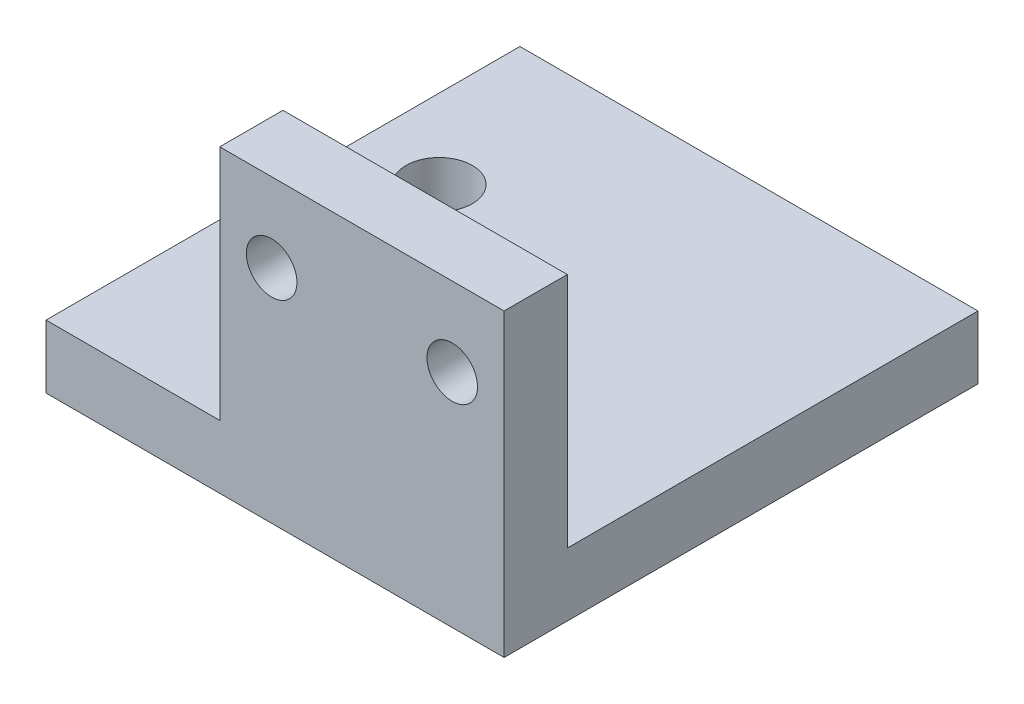
ISO-10303-21;
HEADER;
FILE_DESCRIPTION(('STEP AP214'),'2;1');
FILE_NAME('part.step','',(''),(''),'','','');
FILE_SCHEMA(('AUTOMOTIVE_DESIGN { 1 0 10303 214 1 1 1 1 }'));
ENDSEC;
DATA;
#1=APPLICATION_CONTEXT('core data for automotive mechanical design processes');
#2=APPLICATION_PROTOCOL_DEFINITION('international standard','automotive_design',2000,#1);
#3=PRODUCT_CONTEXT('',#1,'mechanical');
#4=PRODUCT('Part','Part','',(#3));
#5=PRODUCT_RELATED_PRODUCT_CATEGORY('part','',(#4));
#6=PRODUCT_DEFINITION_FORMATION('','',#4);
#7=PRODUCT_DEFINITION_CONTEXT('part definition',#1,'design');
#8=PRODUCT_DEFINITION('design','',#6,#7);
#9=PRODUCT_DEFINITION_SHAPE('','',#8);
#10=(LENGTH_UNIT() NAMED_UNIT(*) SI_UNIT(.MILLI.,.METRE.));
#11=(NAMED_UNIT(*) PLANE_ANGLE_UNIT() SI_UNIT($,.RADIAN.));
#12=(NAMED_UNIT(*) SI_UNIT($,.STERADIAN.) SOLID_ANGLE_UNIT());
#13=UNCERTAINTY_MEASURE_WITH_UNIT(LENGTH_MEASURE(1.E-05),#10,'distance_accuracy_value','');
#14=(GEOMETRIC_REPRESENTATION_CONTEXT(3) GLOBAL_UNCERTAINTY_ASSIGNED_CONTEXT((#13)) GLOBAL_UNIT_ASSIGNED_CONTEXT((#10,
#11,#12)) REPRESENTATION_CONTEXT('',''));
#15=CARTESIAN_POINT('',(0.,0.,0.));
#16=DIRECTION('',(0.,0.,1.));
#17=DIRECTION('',(1.,0.,0.));
#18=AXIS2_PLACEMENT_3D('',#15,#16,#17);
#19=CARTESIAN_POINT('',(-9.,-9.5,2.));
#20=DIRECTION('',(1.,0.,0.));
#21=DIRECTION('',(0.,0.,-1.));
#22=AXIS2_PLACEMENT_3D('',#19,#20,#21);
#23=PLANE('',#22);
#24=DIRECTION('',(0.,0.,-1.));
#25=VECTOR('',#24,1.);
#26=CARTESIAN_POINT('',(-9.,-5.5,2.));
#27=LINE('',#26,#25);
#28=CARTESIAN_POINT('',(-9.,-5.5,2.));
#29=VERTEX_POINT('',#28);
#30=CARTESIAN_POINT('',(-9.,-5.5,-2.));
#31=VERTEX_POINT('',#30);
#32=EDGE_CURVE('E106',#29,#31,#27,.T.);
#33=ORIENTED_EDGE('',*,*,#32,.F.);
#34=DIRECTION('',(0.,-1.,0.));
#35=VECTOR('',#34,1.);
#36=CARTESIAN_POINT('',(-9.,-9.5,2.));
#37=LINE('',#36,#35);
#38=CARTESIAN_POINT('',(-9.,9.5,2.));
#39=VERTEX_POINT('',#38);
#40=EDGE_CURVE('E129',#39,#29,#37,.T.);
#41=ORIENTED_EDGE('',*,*,#40,.F.);
#42=DIRECTION('',(0.,0.,-1.));
#43=VECTOR('',#42,1.);
#44=CARTESIAN_POINT('',(-9.,9.5,2.));
#45=LINE('',#44,#43);
#46=CARTESIAN_POINT('',(-9.,9.5,-2.));
#47=VERTEX_POINT('',#46);
#48=EDGE_CURVE('E126',#39,#47,#45,.T.);
#49=ORIENTED_EDGE('',*,*,#48,.T.);
#50=DIRECTION('',(0.,-1.,0.));
#51=VECTOR('',#50,1.);
#52=CARTESIAN_POINT('',(-9.,-9.5,-2.));
#53=LINE('',#52,#51);
#54=EDGE_CURVE('E120',#47,#31,#53,.T.);
#55=ORIENTED_EDGE('',*,*,#54,.T.);
#56=EDGE_LOOP('',(#33,#41,#49,#55));
#57=FACE_BOUND('',#56,.T.);
#58=ADVANCED_FACE('F55',(#57),#23,.F.);
#59=CARTESIAN_POINT('',(0.,0.,-2.));
#60=DIRECTION('',(0.,0.,-1.));
#61=DIRECTION('',(-1.,0.,0.));
#62=AXIS2_PLACEMENT_3D('',#59,#60,#61);
#63=PLANE('',#62);
#64=CARTESIAN_POINT('',(-5.71500000000001,4.5028,-2.));
#65=DIRECTION('',(0.,0.,-1.));
#66=DIRECTION('',(-1.,0.,0.));
#67=AXIS2_PLACEMENT_3D('',#64,#65,#66);
#68=CIRCLE('',#67,1.59999999999999);
#69=CARTESIAN_POINT('',(-7.315,4.5028,-2.));
#70=VERTEX_POINT('',#69);
#71=EDGE_CURVE('E195',#70,#70,#68,.T.);
#72=ORIENTED_EDGE('',*,*,#71,.F.);
#73=EDGE_LOOP('',(#72));
#74=FACE_BOUND('',#73,.T.);
#75=CARTESIAN_POINT('',(5.71499999999999,4.5028,-2.));
#76=DIRECTION('',(0.,0.,-1.));
#77=DIRECTION('',(-1.,0.,0.));
#78=AXIS2_PLACEMENT_3D('',#75,#76,#77);
#79=CIRCLE('',#78,1.59999999999999);
#80=CARTESIAN_POINT('',(4.115,4.5028,-2.));
#81=VERTEX_POINT('',#80);
#82=EDGE_CURVE('E173',#81,#81,#79,.T.);
#83=ORIENTED_EDGE('',*,*,#82,.F.);
#84=EDGE_LOOP('',(#83));
#85=FACE_BOUND('',#84,.T.);
#86=DIRECTION('',(0.,1.,0.));
#87=VECTOR('',#86,1.);
#88=CARTESIAN_POINT('',(9.,-9.5,-2.));
#89=LINE('',#88,#87);
#90=CARTESIAN_POINT('',(9.,-5.5,-2.));
#91=VERTEX_POINT('',#90);
#92=CARTESIAN_POINT('',(9.,9.5,-2.));
#93=VERTEX_POINT('',#92);
#94=EDGE_CURVE('E93',#91,#93,#89,.T.);
#95=ORIENTED_EDGE('',*,*,#94,.F.);
#96=DIRECTION('',(-1.,0.,0.));
#97=VECTOR('',#96,1.);
#98=CARTESIAN_POINT('',(0.,-5.5,-2.));
#99=LINE('',#98,#97);
#100=EDGE_CURVE('E13',#91,#31,#99,.T.);
#101=ORIENTED_EDGE('',*,*,#100,.T.);
#102=ORIENTED_EDGE('',*,*,#54,.F.);
#103=DIRECTION('',(-1.,0.,0.));
#104=VECTOR('',#103,1.);
#105=CARTESIAN_POINT('',(-9.,9.5,-2.));
#106=LINE('',#105,#104);
#107=EDGE_CURVE('E143',#93,#47,#106,.T.);
#108=ORIENTED_EDGE('',*,*,#107,.F.);
#109=EDGE_LOOP('',(#95,#101,#102,#108));
#110=FACE_BOUND('',#109,.T.);
#111=ADVANCED_FACE('F225',(#74,#85,#110),#63,.T.);
#112=CARTESIAN_POINT('',(9.,-9.5,2.));
#113=DIRECTION('',(-1.,0.,0.));
#114=DIRECTION('',(0.,0.,1.));
#115=AXIS2_PLACEMENT_3D('',#112,#113,#114);
#116=PLANE('',#115);
#117=DIRECTION('',(0.,0.,-1.));
#118=VECTOR('',#117,1.);
#119=CARTESIAN_POINT('',(9.,-9.5,2.));
#120=LINE('',#119,#118);
#121=CARTESIAN_POINT('',(9.,-9.5,2.));
#122=VERTEX_POINT('',#121);
#123=CARTESIAN_POINT('',(9.,-9.5,-28.));
#124=VERTEX_POINT('',#123);
#125=EDGE_CURVE('E135',#122,#124,#120,.T.);
#126=ORIENTED_EDGE('',*,*,#125,.T.);
#127=DIRECTION('',(0.,-1.,0.));
#128=VECTOR('',#127,1.);
#129=CARTESIAN_POINT('',(9.,-9.5,-28.));
#130=LINE('',#129,#128);
#131=CARTESIAN_POINT('',(9.,-5.5,-28.));
#132=VERTEX_POINT('',#131);
#133=EDGE_CURVE('E177',#132,#124,#130,.T.);
#134=ORIENTED_EDGE('',*,*,#133,.F.);
#135=DIRECTION('',(0.,0.,1.));
#136=VECTOR('',#135,1.);
#137=CARTESIAN_POINT('',(9.,-5.5,-28.));
#138=LINE('',#137,#136);
#139=EDGE_CURVE('E157',#132,#91,#138,.T.);
#140=ORIENTED_EDGE('',*,*,#139,.T.);
#141=ORIENTED_EDGE('',*,*,#94,.T.);
#142=DIRECTION('',(0.,0.,-1.));
#143=VECTOR('',#142,1.);
#144=CARTESIAN_POINT('',(9.,9.5,2.));
#145=LINE('',#144,#143);
#146=CARTESIAN_POINT('',(9.,9.5,2.));
#147=VERTEX_POINT('',#146);
#148=EDGE_CURVE('E66',#147,#93,#145,.T.);
#149=ORIENTED_EDGE('',*,*,#148,.F.);
#150=DIRECTION('',(0.,1.,0.));
#151=VECTOR('',#150,1.);
#152=CARTESIAN_POINT('',(9.,-9.5,2.));
#153=LINE('',#152,#151);
#154=EDGE_CURVE('E112',#122,#147,#153,.T.);
#155=ORIENTED_EDGE('',*,*,#154,.F.);
#156=EDGE_LOOP('',(#126,#134,#140,#141,#149,#155));
#157=FACE_BOUND('',#156,.T.);
#158=ADVANCED_FACE('F57',(#157),#116,.F.);
#159=CARTESIAN_POINT('',(-9.,9.5,2.));
#160=DIRECTION('',(0.,-1.,0.));
#161=DIRECTION('',(0.,0.,-1.));
#162=AXIS2_PLACEMENT_3D('',#159,#160,#161);
#163=PLANE('',#162);
#164=ORIENTED_EDGE('',*,*,#107,.T.);
#165=ORIENTED_EDGE('',*,*,#48,.F.);
#166=DIRECTION('',(-1.,0.,0.));
#167=VECTOR('',#166,1.);
#168=CARTESIAN_POINT('',(-9.,9.5,2.));
#169=LINE('',#168,#167);
#170=EDGE_CURVE('E116',#147,#39,#169,.T.);
#171=ORIENTED_EDGE('',*,*,#170,.F.);
#172=ORIENTED_EDGE('',*,*,#148,.T.);
#173=EDGE_LOOP('',(#164,#165,#171,#172));
#174=FACE_BOUND('',#173,.T.);
#175=ADVANCED_FACE('F124',(#174),#163,.F.);
#176=CARTESIAN_POINT('',(-9.,-9.5,2.));
#177=DIRECTION('',(0.,1.,0.));
#178=DIRECTION('',(0.,0.,1.));
#179=AXIS2_PLACEMENT_3D('',#176,#177,#178);
#180=PLANE('',#179);
#181=CARTESIAN_POINT('',(-14.9858,-9.5,-17.875));
#182=DIRECTION('',(0.,-1.,0.));
#183=DIRECTION('',(0.,0.,-1.));
#184=AXIS2_PLACEMENT_3D('',#181,#182,#183);
#185=CIRCLE('',#184,2.1);
#186=CARTESIAN_POINT('',(-14.9858,-9.5,-19.975));
#187=VERTEX_POINT('',#186);
#188=EDGE_CURVE('E203',#187,#187,#185,.T.);
#189=ORIENTED_EDGE('',*,*,#188,.F.);
#190=EDGE_LOOP('',(#189));
#191=FACE_BOUND('',#190,.T.);
#192=DIRECTION('',(1.,0.,0.));
#193=VECTOR('',#192,1.);
#194=CARTESIAN_POINT('',(-9.,-9.5,2.));
#195=LINE('',#194,#193);
#196=CARTESIAN_POINT('',(-20.,-9.49999999999999,2.));
#197=VERTEX_POINT('',#196);
#198=EDGE_CURVE('E76',#197,#122,#195,.T.);
#199=ORIENTED_EDGE('',*,*,#198,.F.);
#200=DIRECTION('',(0.,0.,1.));
#201=VECTOR('',#200,1.);
#202=CARTESIAN_POINT('',(-20.,-9.49999999999999,-28.));
#203=LINE('',#202,#201);
#204=CARTESIAN_POINT('',(-20.,-9.49999999999999,-28.));
#205=VERTEX_POINT('',#204);
#206=EDGE_CURVE('E160',#205,#197,#203,.T.);
#207=ORIENTED_EDGE('',*,*,#206,.F.);
#208=DIRECTION('',(-1.,0.,0.));
#209=VECTOR('',#208,1.);
#210=CARTESIAN_POINT('',(-20.,-9.49999999999999,-28.));
#211=LINE('',#210,#209);
#212=EDGE_CURVE('E164',#124,#205,#211,.T.);
#213=ORIENTED_EDGE('',*,*,#212,.F.);
#214=ORIENTED_EDGE('',*,*,#125,.F.);
#215=EDGE_LOOP('',(#199,#207,#213,#214));
#216=FACE_BOUND('',#215,.T.);
#217=ADVANCED_FACE('F234',(#191,#216),#180,.F.);
#218=CARTESIAN_POINT('',(0.,0.,2.));
#219=DIRECTION('',(0.,0.,-1.));
#220=DIRECTION('',(-1.,0.,0.));
#221=AXIS2_PLACEMENT_3D('',#218,#219,#220);
#222=PLANE('',#221);
#223=CARTESIAN_POINT('',(-5.71500000000001,4.5028,2.));
#224=DIRECTION('',(0.,0.,1.));
#225=DIRECTION('',(1.,0.,0.));
#226=AXIS2_PLACEMENT_3D('',#223,#224,#225);
#227=CIRCLE('',#226,1.6);
#228=CARTESIAN_POINT('',(-4.11500000000001,4.5028,2.));
#229=VERTEX_POINT('',#228);
#230=EDGE_CURVE('E199',#229,#229,#227,.T.);
#231=ORIENTED_EDGE('',*,*,#230,.F.);
#232=EDGE_LOOP('',(#231));
#233=FACE_BOUND('',#232,.T.);
#234=CARTESIAN_POINT('',(5.71499999999999,4.5028,2.));
#235=DIRECTION('',(0.,0.,1.));
#236=DIRECTION('',(1.,0.,0.));
#237=AXIS2_PLACEMENT_3D('',#234,#235,#236);
#238=CIRCLE('',#237,1.6);
#239=CARTESIAN_POINT('',(7.31499999999999,4.5028,2.));
#240=VERTEX_POINT('',#239);
#241=EDGE_CURVE('E191',#240,#240,#238,.T.);
#242=ORIENTED_EDGE('',*,*,#241,.F.);
#243=EDGE_LOOP('',(#242));
#244=FACE_BOUND('',#243,.T.);
#245=ORIENTED_EDGE('',*,*,#154,.T.);
#246=ORIENTED_EDGE('',*,*,#170,.T.);
#247=ORIENTED_EDGE('',*,*,#40,.T.);
#248=DIRECTION('',(1.,0.,0.));
#249=VECTOR('',#248,1.);
#250=CARTESIAN_POINT('',(-20.,-5.49999999999999,2.));
#251=LINE('',#250,#249);
#252=CARTESIAN_POINT('',(-20.,-5.49999999999999,2.));
#253=VERTEX_POINT('',#252);
#254=EDGE_CURVE('E165',#253,#29,#251,.T.);
#255=ORIENTED_EDGE('',*,*,#254,.F.);
#256=DIRECTION('',(0.,1.,0.));
#257=VECTOR('',#256,1.);
#258=CARTESIAN_POINT('',(-20.,-9.49999999999999,2.));
#259=LINE('',#258,#257);
#260=EDGE_CURVE('E169',#197,#253,#259,.T.);
#261=ORIENTED_EDGE('',*,*,#260,.F.);
#262=ORIENTED_EDGE('',*,*,#198,.T.);
#263=EDGE_LOOP('',(#245,#246,#247,#255,#261,#262));
#264=FACE_BOUND('',#263,.T.);
#265=ADVANCED_FACE('F114',(#233,#244,#264),#222,.F.);
#266=CARTESIAN_POINT('',(-20.,-5.49999999999999,-28.));
#267=DIRECTION('',(0.,-1.,0.));
#268=DIRECTION('',(1.,0.,0.));
#269=AXIS2_PLACEMENT_3D('',#266,#267,#268);
#270=PLANE('',#269);
#271=CARTESIAN_POINT('',(-14.9858,-5.5,-17.875));
#272=DIRECTION('',(0.,-1.,0.));
#273=DIRECTION('',(1.,0.,0.));
#274=AXIS2_PLACEMENT_3D('',#271,#272,#273);
#275=CIRCLE('',#274,2.1);
#276=CARTESIAN_POINT('',(-12.8858,-5.5,-17.875));
#277=VERTEX_POINT('',#276);
#278=EDGE_CURVE('E59',#277,#277,#275,.T.);
#279=ORIENTED_EDGE('',*,*,#278,.T.);
#280=EDGE_LOOP('',(#279));
#281=FACE_BOUND('',#280,.T.);
#282=ORIENTED_EDGE('',*,*,#254,.T.);
#283=ORIENTED_EDGE('',*,*,#32,.T.);
#284=ORIENTED_EDGE('',*,*,#100,.F.);
#285=ORIENTED_EDGE('',*,*,#139,.F.);
#286=DIRECTION('',(1.,0.,0.));
#287=VECTOR('',#286,1.);
#288=CARTESIAN_POINT('',(-20.,-5.49999999999999,-28.));
#289=LINE('',#288,#287);
#290=CARTESIAN_POINT('',(-20.,-5.49999999999999,-28.));
#291=VERTEX_POINT('',#290);
#292=EDGE_CURVE('E181',#291,#132,#289,.T.);
#293=ORIENTED_EDGE('',*,*,#292,.F.);
#294=DIRECTION('',(0.,0.,1.));
#295=VECTOR('',#294,1.);
#296=CARTESIAN_POINT('',(-20.,-5.49999999999999,-28.));
#297=LINE('',#296,#295);
#298=EDGE_CURVE('E153',#291,#253,#297,.T.);
#299=ORIENTED_EDGE('',*,*,#298,.T.);
#300=EDGE_LOOP('',(#282,#283,#284,#285,#293,#299));
#301=FACE_BOUND('',#300,.T.);
#302=ADVANCED_FACE('F212',(#281,#301),#270,.F.);
#303=CARTESIAN_POINT('',(-20.,-9.49999999999999,-28.));
#304=DIRECTION('',(1.,0.,0.));
#305=DIRECTION('',(0.,0.,-1.));
#306=AXIS2_PLACEMENT_3D('',#303,#304,#305);
#307=PLANE('',#306);
#308=ORIENTED_EDGE('',*,*,#260,.T.);
#309=ORIENTED_EDGE('',*,*,#298,.F.);
#310=DIRECTION('',(0.,1.,0.));
#311=VECTOR('',#310,1.);
#312=CARTESIAN_POINT('',(-20.,-9.49999999999999,-28.));
#313=LINE('',#312,#311);
#314=EDGE_CURVE('E168',#205,#291,#313,.T.);
#315=ORIENTED_EDGE('',*,*,#314,.F.);
#316=ORIENTED_EDGE('',*,*,#206,.T.);
#317=EDGE_LOOP('',(#308,#309,#315,#316));
#318=FACE_BOUND('',#317,.T.);
#319=ADVANCED_FACE('F256',(#318),#307,.F.);
#320=CARTESIAN_POINT('',(0.,0.,-28.));
#321=DIRECTION('',(0.,0.,-1.));
#322=DIRECTION('',(-1.,0.,0.));
#323=AXIS2_PLACEMENT_3D('',#320,#321,#322);
#324=PLANE('',#323);
#325=ORIENTED_EDGE('',*,*,#314,.T.);
#326=ORIENTED_EDGE('',*,*,#292,.T.);
#327=ORIENTED_EDGE('',*,*,#133,.T.);
#328=ORIENTED_EDGE('',*,*,#212,.T.);
#329=EDGE_LOOP('',(#325,#326,#327,#328));
#330=FACE_BOUND('',#329,.T.);
#331=ADVANCED_FACE('F254',(#330),#324,.T.);
#332=CARTESIAN_POINT('',(5.71499999999999,4.5028,2.));
#333=DIRECTION('',(0.,0.,1.));
#334=DIRECTION('',(1.,0.,0.));
#335=AXIS2_PLACEMENT_3D('',#332,#333,#334);
#336=CYLINDRICAL_SURFACE('',#335,1.59999999999999);
#337=ORIENTED_EDGE('',*,*,#82,.T.);
#338=EDGE_LOOP('',(#337));
#339=FACE_BOUND('',#338,.T.);
#340=ORIENTED_EDGE('',*,*,#241,.T.);
#341=EDGE_LOOP('',(#340));
#342=FACE_BOUND('',#341,.T.);
#343=ADVANCED_FACE('F221',(#339,#342),#336,.F.);
#344=CARTESIAN_POINT('',(-5.71500000000001,4.5028,2.));
#345=DIRECTION('',(0.,0.,1.));
#346=DIRECTION('',(1.,0.,0.));
#347=AXIS2_PLACEMENT_3D('',#344,#345,#346);
#348=CYLINDRICAL_SURFACE('',#347,1.59999999999999);
#349=ORIENTED_EDGE('',*,*,#71,.T.);
#350=EDGE_LOOP('',(#349));
#351=FACE_BOUND('',#350,.T.);
#352=ORIENTED_EDGE('',*,*,#230,.T.);
#353=EDGE_LOOP('',(#352));
#354=FACE_BOUND('',#353,.T.);
#355=ADVANCED_FACE('F216',(#351,#354),#348,.F.);
#356=CARTESIAN_POINT('',(-14.9858,-9.5,-17.875));
#357=DIRECTION('',(0.,-1.,0.));
#358=DIRECTION('',(0.,0.,-1.));
#359=AXIS2_PLACEMENT_3D('',#356,#357,#358);
#360=CYLINDRICAL_SURFACE('',#359,2.1);
#361=ORIENTED_EDGE('',*,*,#188,.T.);
#362=EDGE_LOOP('',(#361));
#363=FACE_BOUND('',#362,.T.);
#364=ORIENTED_EDGE('',*,*,#278,.F.);
#365=EDGE_LOOP('',(#364));
#366=FACE_BOUND('',#365,.T.);
#367=ADVANCED_FACE('F214',(#363,#366),#360,.F.);
#368=CLOSED_SHELL('',(#58,#111,#158,#175,#217,#265,#302,#319,#331,#343,#355,#367));
#369=MANIFOLD_SOLID_BREP('B2',#368);
#370=ADVANCED_BREP_SHAPE_REPRESENTATION('',(#18,#369),#14);
#371=SHAPE_DEFINITION_REPRESENTATION(#9,#370);
ENDSEC;
END-ISO-10303-21;
